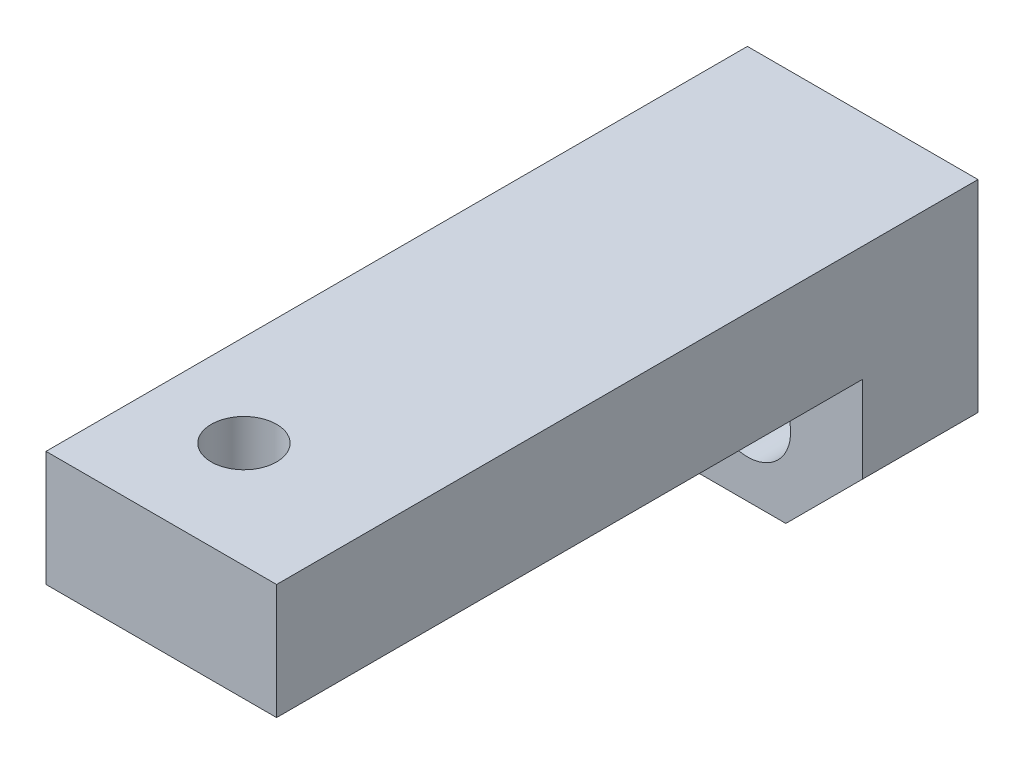
ISO-10303-21;
HEADER;
FILE_DESCRIPTION(('STEP AP214'),'2;1');
FILE_NAME('part.step','',(''),(''),'','','');
FILE_SCHEMA(('AUTOMOTIVE_DESIGN { 1 0 10303 214 1 1 1 1 }'));
ENDSEC;
DATA;
#1=APPLICATION_CONTEXT('core data for automotive mechanical design processes');
#2=APPLICATION_PROTOCOL_DEFINITION('international standard','automotive_design',2000,#1);
#3=PRODUCT_CONTEXT('',#1,'mechanical');
#4=PRODUCT('Part','Part','',(#3));
#5=PRODUCT_RELATED_PRODUCT_CATEGORY('part','',(#4));
#6=PRODUCT_DEFINITION_FORMATION('','',#4);
#7=PRODUCT_DEFINITION_CONTEXT('part definition',#1,'design');
#8=PRODUCT_DEFINITION('design','',#6,#7);
#9=PRODUCT_DEFINITION_SHAPE('','',#8);
#10=(LENGTH_UNIT() NAMED_UNIT(*) SI_UNIT(.MILLI.,.METRE.));
#11=(NAMED_UNIT(*) PLANE_ANGLE_UNIT() SI_UNIT($,.RADIAN.));
#12=(NAMED_UNIT(*) SI_UNIT($,.STERADIAN.) SOLID_ANGLE_UNIT());
#13=UNCERTAINTY_MEASURE_WITH_UNIT(LENGTH_MEASURE(1.E-05),#10,'distance_accuracy_value','');
#14=(GEOMETRIC_REPRESENTATION_CONTEXT(3) GLOBAL_UNCERTAINTY_ASSIGNED_CONTEXT((#13)) GLOBAL_UNIT_ASSIGNED_CONTEXT((#10,
#11,#12)) REPRESENTATION_CONTEXT('',''));
#15=CARTESIAN_POINT('',(0.,0.,0.));
#16=DIRECTION('',(0.,0.,1.));
#17=DIRECTION('',(1.,0.,0.));
#18=AXIS2_PLACEMENT_3D('',#15,#16,#17);
#19=CARTESIAN_POINT('',(-4.78,-14.5,36.5));
#20=DIRECTION('',(0.,-1.,0.));
#21=DIRECTION('',(0.,0.,-1.));
#22=AXIS2_PLACEMENT_3D('',#19,#20,#21);
#23=PLANE('',#22);
#24=DIRECTION('',(1.,0.,0.));
#25=VECTOR('',#24,1.);
#26=CARTESIAN_POINT('',(-4.78,-14.5,0.));
#27=LINE('',#26,#25);
#28=CARTESIAN_POINT('',(-4.78,-14.5,0.));
#29=VERTEX_POINT('',#28);
#30=CARTESIAN_POINT('',(3.21999999999998,-14.5,0.));
#31=VERTEX_POINT('',#30);
#32=EDGE_CURVE('E136',#29,#31,#27,.T.);
#33=ORIENTED_EDGE('',*,*,#32,.T.);
#34=DIRECTION('',(0.,0.,1.));
#35=VECTOR('',#34,1.);
#36=CARTESIAN_POINT('',(3.21999999999998,-14.5,36.5));
#37=LINE('',#36,#35);
#38=CARTESIAN_POINT('',(3.21999999999998,-14.5,6.));
#39=VERTEX_POINT('',#38);
#40=EDGE_CURVE('E55',#31,#39,#37,.T.);
#41=ORIENTED_EDGE('',*,*,#40,.T.);
#42=DIRECTION('',(-1.,0.,0.));
#43=VECTOR('',#42,1.);
#44=CARTESIAN_POINT('',(7.22,-14.5,6.));
#45=LINE('',#44,#43);
#46=CARTESIAN_POINT('',(-4.78,-14.5,6.));
#47=VERTEX_POINT('',#46);
#48=EDGE_CURVE('E152',#39,#47,#45,.T.);
#49=ORIENTED_EDGE('',*,*,#48,.T.);
#50=DIRECTION('',(0.,0.,-1.));
#51=VECTOR('',#50,1.);
#52=CARTESIAN_POINT('',(-4.78,-14.5,36.5));
#53=LINE('',#52,#51);
#54=EDGE_CURVE('E144',#47,#29,#53,.T.);
#55=ORIENTED_EDGE('',*,*,#54,.T.);
#56=EDGE_LOOP('',(#33,#41,#49,#55));
#57=FACE_BOUND('',#56,.T.);
#58=ADVANCED_FACE('F43',(#57),#23,.T.);
#59=CARTESIAN_POINT('',(-4.78,0.,0.));
#60=DIRECTION('',(1.,0.,0.));
#61=DIRECTION('',(0.,0.,-1.));
#62=AXIS2_PLACEMENT_3D('',#59,#60,#61);
#63=PLANE('',#62);
#64=DIRECTION('',(0.,0.,-1.));
#65=VECTOR('',#64,1.);
#66=CARTESIAN_POINT('',(-4.78,-6.,36.5));
#67=LINE('',#66,#65);
#68=CARTESIAN_POINT('',(-4.78,-6.,36.5));
#69=VERTEX_POINT('',#68);
#70=CARTESIAN_POINT('',(-4.78,-6.,6.));
#71=VERTEX_POINT('',#70);
#72=EDGE_CURVE('E163',#69,#71,#67,.T.);
#73=ORIENTED_EDGE('',*,*,#72,.F.);
#74=DIRECTION('',(0.,-1.,0.));
#75=VECTOR('',#74,1.);
#76=CARTESIAN_POINT('',(-4.78,0.,36.5));
#77=LINE('',#76,#75);
#78=CARTESIAN_POINT('',(-4.78,0.,36.5));
#79=VERTEX_POINT('',#78);
#80=EDGE_CURVE('E125',#79,#69,#77,.T.);
#81=ORIENTED_EDGE('',*,*,#80,.F.);
#82=DIRECTION('',(0.,0.,1.));
#83=VECTOR('',#82,1.);
#84=CARTESIAN_POINT('',(-4.78,0.,0.));
#85=LINE('',#84,#83);
#86=CARTESIAN_POINT('',(-4.78,0.,0.));
#87=VERTEX_POINT('',#86);
#88=EDGE_CURVE('E130',#87,#79,#85,.T.);
#89=ORIENTED_EDGE('',*,*,#88,.F.);
#90=DIRECTION('',(0.,1.,0.));
#91=VECTOR('',#90,1.);
#92=CARTESIAN_POINT('',(-4.78,-14.5,0.));
#93=LINE('',#92,#91);
#94=EDGE_CURVE('E127',#29,#87,#93,.T.);
#95=ORIENTED_EDGE('',*,*,#94,.F.);
#96=ORIENTED_EDGE('',*,*,#54,.F.);
#97=DIRECTION('',(0.,-1.,0.));
#98=VECTOR('',#97,1.);
#99=CARTESIAN_POINT('',(-4.78,-6.,6.));
#100=LINE('',#99,#98);
#101=EDGE_CURVE('E113',#71,#47,#100,.T.);
#102=ORIENTED_EDGE('',*,*,#101,.F.);
#103=EDGE_LOOP('',(#73,#81,#89,#95,#96,#102));
#104=FACE_BOUND('',#103,.T.);
#105=ADVANCED_FACE('F190',(#104),#63,.F.);
#106=CARTESIAN_POINT('',(7.22,0.,0.));
#107=DIRECTION('',(1.,0.,0.));
#108=DIRECTION('',(0.,0.,-1.));
#109=AXIS2_PLACEMENT_3D('',#106,#107,#108);
#110=PLANE('',#109);
#111=DIRECTION('',(0.,-1.,0.));
#112=VECTOR('',#111,1.);
#113=CARTESIAN_POINT('',(7.22,-6.,6.));
#114=LINE('',#113,#112);
#115=CARTESIAN_POINT('',(7.22,-6.,6.));
#116=VERTEX_POINT('',#115);
#117=CARTESIAN_POINT('',(7.22,-10.5,6.));
#118=VERTEX_POINT('',#117);
#119=EDGE_CURVE('E115',#116,#118,#114,.T.);
#120=ORIENTED_EDGE('',*,*,#119,.T.);
#121=DIRECTION('',(0.,0.,-1.));
#122=VECTOR('',#121,1.);
#123=CARTESIAN_POINT('',(7.22,-10.5,0.));
#124=LINE('',#123,#122);
#125=CARTESIAN_POINT('',(7.22,-10.5,0.));
#126=VERTEX_POINT('',#125);
#127=EDGE_CURVE('E138',#118,#126,#124,.T.);
#128=ORIENTED_EDGE('',*,*,#127,.T.);
#129=DIRECTION('',(0.,1.,0.));
#130=VECTOR('',#129,1.);
#131=CARTESIAN_POINT('',(7.22,-14.5,0.));
#132=LINE('',#131,#130);
#133=CARTESIAN_POINT('',(7.22,0.,0.));
#134=VERTEX_POINT('',#133);
#135=EDGE_CURVE('E135',#126,#134,#132,.T.);
#136=ORIENTED_EDGE('',*,*,#135,.T.);
#137=DIRECTION('',(0.,0.,1.));
#138=VECTOR('',#137,1.);
#139=CARTESIAN_POINT('',(7.22,0.,0.));
#140=LINE('',#139,#138);
#141=CARTESIAN_POINT('',(7.22,0.,36.5));
#142=VERTEX_POINT('',#141);
#143=EDGE_CURVE('E126',#134,#142,#140,.T.);
#144=ORIENTED_EDGE('',*,*,#143,.T.);
#145=DIRECTION('',(0.,-1.,0.));
#146=VECTOR('',#145,1.);
#147=CARTESIAN_POINT('',(7.22,0.,36.5));
#148=LINE('',#147,#146);
#149=CARTESIAN_POINT('',(7.22,-6.,36.5));
#150=VERTEX_POINT('',#149);
#151=EDGE_CURVE('E118',#142,#150,#148,.T.);
#152=ORIENTED_EDGE('',*,*,#151,.T.);
#153=DIRECTION('',(0.,0.,-1.));
#154=VECTOR('',#153,1.);
#155=CARTESIAN_POINT('',(7.22,-6.,36.5));
#156=LINE('',#155,#154);
#157=EDGE_CURVE('E105',#150,#116,#156,.T.);
#158=ORIENTED_EDGE('',*,*,#157,.T.);
#159=EDGE_LOOP('',(#120,#128,#136,#144,#152,#158));
#160=FACE_BOUND('',#159,.T.);
#161=ADVANCED_FACE('F121',(#160),#110,.T.);
#162=CARTESIAN_POINT('',(-4.78,-14.5,0.));
#163=DIRECTION('',(0.,0.,-1.));
#164=DIRECTION('',(0.,1.,0.));
#165=AXIS2_PLACEMENT_3D('',#162,#163,#164);
#166=PLANE('',#165);
#167=CARTESIAN_POINT('',(1.22,-10.25,0.));
#168=DIRECTION('',(0.,0.,-1.));
#169=DIRECTION('',(-1.,0.,0.));
#170=AXIS2_PLACEMENT_3D('',#167,#168,#169);
#171=CIRCLE('',#170,2.24999999999999);
#172=CARTESIAN_POINT('',(-1.02999999999999,-10.25,0.));
#173=VERTEX_POINT('',#172);
#174=EDGE_CURVE('E170',#173,#173,#171,.T.);
#175=ORIENTED_EDGE('',*,*,#174,.F.);
#176=EDGE_LOOP('',(#175));
#177=FACE_BOUND('',#176,.T.);
#178=ORIENTED_EDGE('',*,*,#135,.F.);
#179=DIRECTION('',(0.70710678118655,0.707106781186545,0.));
#180=VECTOR('',#179,1.);
#181=CARTESIAN_POINT('',(-0.780000000000037,-18.5,0.));
#182=LINE('',#181,#180);
#183=EDGE_CURVE('E67',#126,#31,#182,.F.);
#184=ORIENTED_EDGE('',*,*,#183,.T.);
#185=ORIENTED_EDGE('',*,*,#32,.F.);
#186=ORIENTED_EDGE('',*,*,#94,.T.);
#187=DIRECTION('',(1.,0.,0.));
#188=VECTOR('',#187,1.);
#189=CARTESIAN_POINT('',(-4.78,0.,0.));
#190=LINE('',#189,#188);
#191=EDGE_CURVE('E142',#87,#134,#190,.T.);
#192=ORIENTED_EDGE('',*,*,#191,.T.);
#193=EDGE_LOOP('',(#178,#184,#185,#186,#192));
#194=FACE_BOUND('',#193,.T.);
#195=ADVANCED_FACE('F150',(#177,#194),#166,.T.);
#196=CARTESIAN_POINT('',(-4.78,0.,36.5));
#197=DIRECTION('',(0.,0.,1.));
#198=DIRECTION('',(1.,0.,0.));
#199=AXIS2_PLACEMENT_3D('',#196,#197,#198);
#200=PLANE('',#199);
#201=DIRECTION('',(-1.,0.,0.));
#202=VECTOR('',#201,1.);
#203=CARTESIAN_POINT('',(7.22,-6.,36.5));
#204=LINE('',#203,#202);
#205=EDGE_CURVE('E106',#150,#69,#204,.T.);
#206=ORIENTED_EDGE('',*,*,#205,.F.);
#207=ORIENTED_EDGE('',*,*,#151,.F.);
#208=DIRECTION('',(1.,0.,0.));
#209=VECTOR('',#208,1.);
#210=CARTESIAN_POINT('',(-4.78,0.,36.5));
#211=LINE('',#210,#209);
#212=EDGE_CURVE('E137',#79,#142,#211,.T.);
#213=ORIENTED_EDGE('',*,*,#212,.F.);
#214=ORIENTED_EDGE('',*,*,#80,.T.);
#215=EDGE_LOOP('',(#206,#207,#213,#214));
#216=FACE_BOUND('',#215,.T.);
#217=ADVANCED_FACE('F117',(#216),#200,.T.);
#218=CARTESIAN_POINT('',(-4.78,0.,0.));
#219=DIRECTION('',(0.,1.,0.));
#220=DIRECTION('',(0.,0.,1.));
#221=AXIS2_PLACEMENT_3D('',#218,#219,#220);
#222=PLANE('',#221);
#223=CARTESIAN_POINT('',(0.,0.,30.98));
#224=DIRECTION('',(0.,1.,0.));
#225=DIRECTION('',(0.,0.,1.));
#226=AXIS2_PLACEMENT_3D('',#223,#224,#225);
#227=CIRCLE('',#226,1.69999999999999);
#228=CARTESIAN_POINT('',(0.,0.,32.68));
#229=VERTEX_POINT('',#228);
#230=EDGE_CURVE('E173',#229,#229,#227,.T.);
#231=ORIENTED_EDGE('',*,*,#230,.F.);
#232=EDGE_LOOP('',(#231));
#233=FACE_BOUND('',#232,.T.);
#234=ORIENTED_EDGE('',*,*,#143,.F.);
#235=ORIENTED_EDGE('',*,*,#191,.F.);
#236=ORIENTED_EDGE('',*,*,#88,.T.);
#237=ORIENTED_EDGE('',*,*,#212,.T.);
#238=EDGE_LOOP('',(#234,#235,#236,#237));
#239=FACE_BOUND('',#238,.T.);
#240=ADVANCED_FACE('F179',(#233,#239),#222,.T.);
#241=CARTESIAN_POINT('',(7.22,-6.,6.));
#242=DIRECTION('',(0.,0.,-1.));
#243=DIRECTION('',(-1.,0.,0.));
#244=AXIS2_PLACEMENT_3D('',#241,#242,#243);
#245=PLANE('',#244);
#246=CARTESIAN_POINT('',(1.22,-10.25,6.));
#247=DIRECTION('',(0.,0.,-1.));
#248=DIRECTION('',(-1.,0.,0.));
#249=AXIS2_PLACEMENT_3D('',#246,#247,#248);
#250=CIRCLE('',#249,2.24999999999999);
#251=CARTESIAN_POINT('',(-1.02999999999999,-10.25,6.));
#252=VERTEX_POINT('',#251);
#253=EDGE_CURVE('E161',#252,#252,#250,.T.);
#254=ORIENTED_EDGE('',*,*,#253,.T.);
#255=EDGE_LOOP('',(#254));
#256=FACE_BOUND('',#255,.T.);
#257=ORIENTED_EDGE('',*,*,#48,.F.);
#258=DIRECTION('',(-0.70710678118655,-0.707106781186545,0.));
#259=VECTOR('',#258,1.);
#260=CARTESIAN_POINT('',(7.22,-10.5,6.));
#261=LINE('',#260,#259);
#262=EDGE_CURVE('E11',#39,#118,#261,.F.);
#263=ORIENTED_EDGE('',*,*,#262,.T.);
#264=ORIENTED_EDGE('',*,*,#119,.F.);
#265=DIRECTION('',(-1.,0.,0.));
#266=VECTOR('',#265,1.);
#267=CARTESIAN_POINT('',(7.22,-6.,6.));
#268=LINE('',#267,#266);
#269=EDGE_CURVE('E108',#116,#71,#268,.T.);
#270=ORIENTED_EDGE('',*,*,#269,.T.);
#271=ORIENTED_EDGE('',*,*,#101,.T.);
#272=EDGE_LOOP('',(#257,#263,#264,#270,#271));
#273=FACE_BOUND('',#272,.T.);
#274=ADVANCED_FACE('F182',(#256,#273),#245,.F.);
#275=CARTESIAN_POINT('',(7.22,-6.,36.5));
#276=DIRECTION('',(0.,1.,0.));
#277=DIRECTION('',(0.,0.,1.));
#278=AXIS2_PLACEMENT_3D('',#275,#276,#277);
#279=PLANE('',#278);
#280=CARTESIAN_POINT('',(0.,-6.,30.98));
#281=DIRECTION('',(0.,1.,0.));
#282=DIRECTION('',(0.,0.,1.));
#283=AXIS2_PLACEMENT_3D('',#280,#281,#282);
#284=CIRCLE('',#283,1.69999999999999);
#285=CARTESIAN_POINT('',(0.,-6.,32.68));
#286=VERTEX_POINT('',#285);
#287=EDGE_CURVE('E167',#286,#286,#284,.T.);
#288=ORIENTED_EDGE('',*,*,#287,.T.);
#289=EDGE_LOOP('',(#288));
#290=FACE_BOUND('',#289,.T.);
#291=ORIENTED_EDGE('',*,*,#72,.T.);
#292=ORIENTED_EDGE('',*,*,#269,.F.);
#293=ORIENTED_EDGE('',*,*,#157,.F.);
#294=ORIENTED_EDGE('',*,*,#205,.T.);
#295=EDGE_LOOP('',(#291,#292,#293,#294));
#296=FACE_BOUND('',#295,.T.);
#297=ADVANCED_FACE('F102',(#290,#296),#279,.F.);
#298=CARTESIAN_POINT('',(1.22,-10.25,0.));
#299=DIRECTION('',(0.,0.,-1.));
#300=DIRECTION('',(-1.,0.,0.));
#301=AXIS2_PLACEMENT_3D('',#298,#299,#300);
#302=CYLINDRICAL_SURFACE('',#301,2.24999999999999);
#303=ORIENTED_EDGE('',*,*,#174,.T.);
#304=EDGE_LOOP('',(#303));
#305=FACE_BOUND('',#304,.T.);
#306=ORIENTED_EDGE('',*,*,#253,.F.);
#307=EDGE_LOOP('',(#306));
#308=FACE_BOUND('',#307,.T.);
#309=ADVANCED_FACE('F200',(#305,#308),#302,.F.);
#310=CARTESIAN_POINT('',(0.,0.,30.98));
#311=DIRECTION('',(0.,1.,0.));
#312=DIRECTION('',(0.,0.,1.));
#313=AXIS2_PLACEMENT_3D('',#310,#311,#312);
#314=CYLINDRICAL_SURFACE('',#313,1.69999999999999);
#315=ORIENTED_EDGE('',*,*,#230,.T.);
#316=EDGE_LOOP('',(#315));
#317=FACE_BOUND('',#316,.T.);
#318=ORIENTED_EDGE('',*,*,#287,.F.);
#319=EDGE_LOOP('',(#318));
#320=FACE_BOUND('',#319,.T.);
#321=ADVANCED_FACE('F180',(#317,#320),#314,.F.);
#322=CARTESIAN_POINT('',(7.22,-10.5,0.));
#323=DIRECTION('',(-0.707106781186545,0.70710678118655,0.));
#324=DIRECTION('',(0.,0.,-1.));
#325=AXIS2_PLACEMENT_3D('',#322,#323,#324);
#326=PLANE('',#325);
#327=ORIENTED_EDGE('',*,*,#262,.F.);
#328=ORIENTED_EDGE('',*,*,#40,.F.);
#329=ORIENTED_EDGE('',*,*,#183,.F.);
#330=ORIENTED_EDGE('',*,*,#127,.F.);
#331=EDGE_LOOP('',(#327,#328,#329,#330));
#332=FACE_BOUND('',#331,.T.);
#333=ADVANCED_FACE('F46',(#332),#326,.F.);
#334=CLOSED_SHELL('',(#58,#105,#161,#195,#217,#240,#274,#297,#309,#321,#333));
#335=MANIFOLD_SOLID_BREP('B2',#334);
#336=ADVANCED_BREP_SHAPE_REPRESENTATION('',(#18,#335),#14);
#337=SHAPE_DEFINITION_REPRESENTATION(#9,#336);
ENDSEC;
END-ISO-10303-21;
